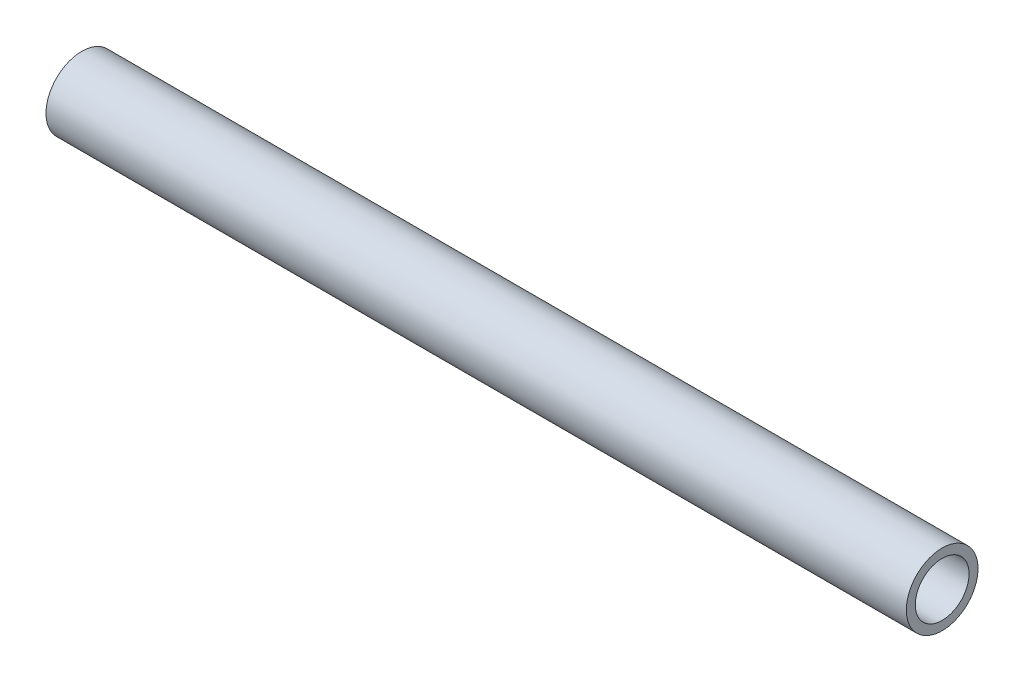
ISO-10303-21;
HEADER;
FILE_DESCRIPTION(('STEP AP214'),'2;1');
FILE_NAME('part.step','',(''),(''),'','','');
FILE_SCHEMA(('AUTOMOTIVE_DESIGN { 1 0 10303 214 1 1 1 1 }'));
ENDSEC;
DATA;
#1=APPLICATION_CONTEXT('core data for automotive mechanical design processes');
#2=APPLICATION_PROTOCOL_DEFINITION('international standard','automotive_design',2000,#1);
#3=PRODUCT_CONTEXT('',#1,'mechanical');
#4=PRODUCT('Part','Part','',(#3));
#5=PRODUCT_RELATED_PRODUCT_CATEGORY('part','',(#4));
#6=PRODUCT_DEFINITION_FORMATION('','',#4);
#7=PRODUCT_DEFINITION_CONTEXT('part definition',#1,'design');
#8=PRODUCT_DEFINITION('design','',#6,#7);
#9=PRODUCT_DEFINITION_SHAPE('','',#8);
#10=(LENGTH_UNIT() NAMED_UNIT(*) SI_UNIT(.MILLI.,.METRE.));
#11=(NAMED_UNIT(*) PLANE_ANGLE_UNIT() SI_UNIT($,.RADIAN.));
#12=(NAMED_UNIT(*) SI_UNIT($,.STERADIAN.) SOLID_ANGLE_UNIT());
#13=UNCERTAINTY_MEASURE_WITH_UNIT(LENGTH_MEASURE(1.E-05),#10,'distance_accuracy_value','');
#14=(GEOMETRIC_REPRESENTATION_CONTEXT(3) GLOBAL_UNCERTAINTY_ASSIGNED_CONTEXT((#13)) GLOBAL_UNIT_ASSIGNED_CONTEXT((#10,
#11,#12)) REPRESENTATION_CONTEXT('',''));
#15=CARTESIAN_POINT('',(0.,0.,0.));
#16=DIRECTION('',(0.,0.,1.));
#17=DIRECTION('',(1.,0.,0.));
#18=AXIS2_PLACEMENT_3D('',#15,#16,#17);
#19=CARTESIAN_POINT('',(0.,4.7625,0.));
#20=DIRECTION('',(1.,0.,0.));
#21=DIRECTION('',(0.,1.,0.));
#22=AXIS2_PLACEMENT_3D('',#19,#20,#21);
#23=PLANE('',#22);
#24=CARTESIAN_POINT('',(0.,0.,0.));
#25=DIRECTION('',(1.,0.,0.));
#26=DIRECTION('',(0.,1.,0.));
#27=AXIS2_PLACEMENT_3D('',#24,#25,#26);
#28=CIRCLE('',#27,6.35);
#29=CARTESIAN_POINT('',(0.,6.35,0.));
#30=VERTEX_POINT('',#29);
#31=EDGE_CURVE('E10',#30,#30,#28,.T.);
#32=ORIENTED_EDGE('',*,*,#31,.T.);
#33=EDGE_LOOP('',(#32));
#34=FACE_BOUND('',#33,.T.);
#35=CARTESIAN_POINT('',(0.,0.,0.));
#36=DIRECTION('',(1.,0.,0.));
#37=DIRECTION('',(0.,1.,0.));
#38=AXIS2_PLACEMENT_3D('',#35,#36,#37);
#39=CIRCLE('',#38,4.7625);
#40=CARTESIAN_POINT('',(0.,4.7625,0.));
#41=VERTEX_POINT('',#40);
#42=EDGE_CURVE('E45',#41,#41,#39,.T.);
#43=ORIENTED_EDGE('',*,*,#42,.F.);
#44=EDGE_LOOP('',(#43));
#45=FACE_BOUND('',#44,.T.);
#46=ADVANCED_FACE('F31',(#34,#45),#23,.T.);
#47=CARTESIAN_POINT('',(-50.4967407722299,0.,0.));
#48=DIRECTION('',(1.,0.,0.));
#49=DIRECTION('',(0.,1.,0.));
#50=AXIS2_PLACEMENT_3D('',#47,#48,#49);
#51=CYLINDRICAL_SURFACE('',#50,6.35);
#52=CARTESIAN_POINT('',(-152.4,0.,0.));
#53=DIRECTION('',(1.,0.,0.));
#54=DIRECTION('',(0.,1.,0.));
#55=AXIS2_PLACEMENT_3D('',#52,#53,#54);
#56=CIRCLE('',#55,6.35);
#57=CARTESIAN_POINT('',(-152.4,6.34999999999999,0.));
#58=VERTEX_POINT('',#57);
#59=EDGE_CURVE('E37',#58,#58,#56,.T.);
#60=ORIENTED_EDGE('',*,*,#59,.T.);
#61=EDGE_LOOP('',(#60));
#62=FACE_BOUND('',#61,.T.);
#63=ORIENTED_EDGE('',*,*,#31,.F.);
#64=EDGE_LOOP('',(#63));
#65=FACE_BOUND('',#64,.T.);
#66=ADVANCED_FACE('F55',(#62,#65),#51,.T.);
#67=CARTESIAN_POINT('',(-152.4,4.76249999999998,0.));
#68=DIRECTION('',(-1.,0.,0.));
#69=DIRECTION('',(0.,-1.,0.));
#70=AXIS2_PLACEMENT_3D('',#67,#68,#69);
#71=PLANE('',#70);
#72=CARTESIAN_POINT('',(-152.4,0.,0.));
#73=DIRECTION('',(1.,0.,0.));
#74=DIRECTION('',(0.,1.,0.));
#75=AXIS2_PLACEMENT_3D('',#72,#73,#74);
#76=CIRCLE('',#75,4.76249999999999);
#77=CARTESIAN_POINT('',(-152.4,4.76249999999998,0.));
#78=VERTEX_POINT('',#77);
#79=EDGE_CURVE('E41',#78,#78,#76,.T.);
#80=ORIENTED_EDGE('',*,*,#79,.T.);
#81=EDGE_LOOP('',(#80));
#82=FACE_BOUND('',#81,.T.);
#83=ORIENTED_EDGE('',*,*,#59,.F.);
#84=EDGE_LOOP('',(#83));
#85=FACE_BOUND('',#84,.T.);
#86=ADVANCED_FACE('F59',(#82,#85),#71,.T.);
#87=CARTESIAN_POINT('',(-50.4967407722299,0.,0.));
#88=DIRECTION('',(1.,0.,0.));
#89=DIRECTION('',(0.,1.,0.));
#90=AXIS2_PLACEMENT_3D('',#87,#88,#89);
#91=CYLINDRICAL_SURFACE('',#90,4.7625);
#92=ORIENTED_EDGE('',*,*,#42,.T.);
#93=EDGE_LOOP('',(#92));
#94=FACE_BOUND('',#93,.T.);
#95=ORIENTED_EDGE('',*,*,#79,.F.);
#96=EDGE_LOOP('',(#95));
#97=FACE_BOUND('',#96,.T.);
#98=ADVANCED_FACE('F51',(#94,#97),#91,.F.);
#99=CLOSED_SHELL('',(#46,#66,#86,#98));
#100=MANIFOLD_SOLID_BREP('B2',#99);
#101=ADVANCED_BREP_SHAPE_REPRESENTATION('',(#18,#100),#14);
#102=SHAPE_DEFINITION_REPRESENTATION(#9,#101);
ENDSEC;
END-ISO-10303-21;
